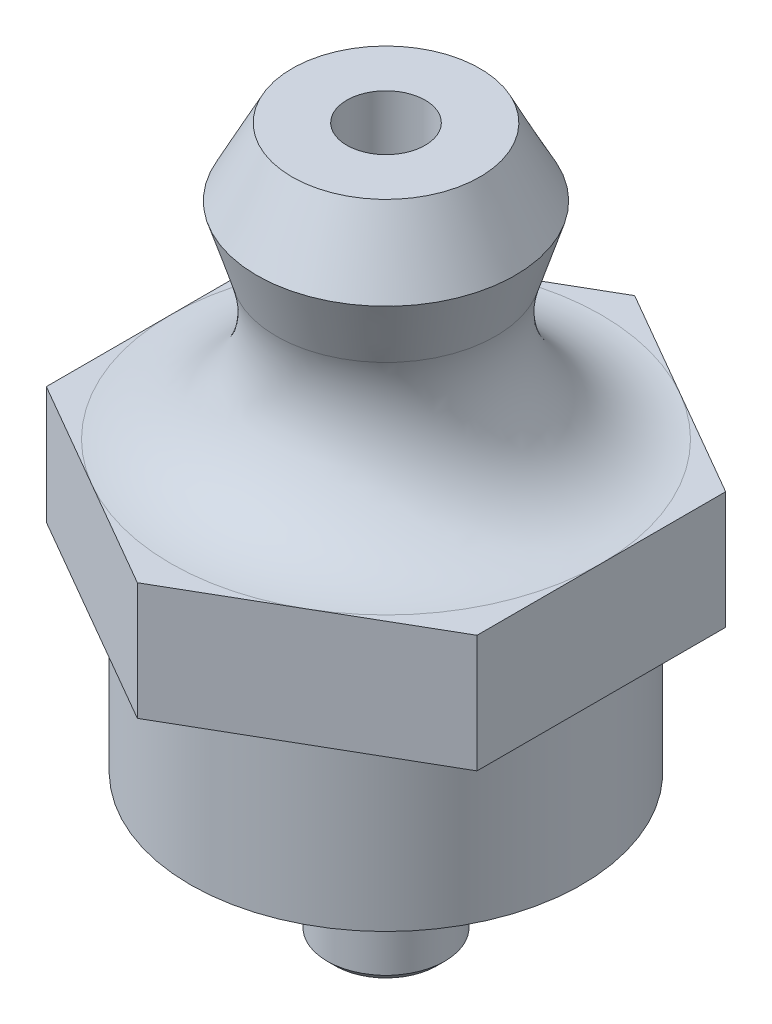
ISO-10303-21;
HEADER;
FILE_DESCRIPTION(('STEP AP214'),'2;1');
FILE_NAME('part.step','',(''),(''),'','','');
FILE_SCHEMA(('AUTOMOTIVE_DESIGN { 1 0 10303 214 1 1 1 1 }'));
ENDSEC;
DATA;
#1=APPLICATION_CONTEXT('core data for automotive mechanical design processes');
#2=APPLICATION_PROTOCOL_DEFINITION('international standard','automotive_design',2000,#1);
#3=PRODUCT_CONTEXT('',#1,'mechanical');
#4=PRODUCT('Part','Part','',(#3));
#5=PRODUCT_RELATED_PRODUCT_CATEGORY('part','',(#4));
#6=PRODUCT_DEFINITION_FORMATION('','',#4);
#7=PRODUCT_DEFINITION_CONTEXT('part definition',#1,'design');
#8=PRODUCT_DEFINITION('design','',#6,#7);
#9=PRODUCT_DEFINITION_SHAPE('','',#8);
#10=(LENGTH_UNIT() NAMED_UNIT(*) SI_UNIT(.MILLI.,.METRE.));
#11=(NAMED_UNIT(*) PLANE_ANGLE_UNIT() SI_UNIT($,.RADIAN.));
#12=(NAMED_UNIT(*) SI_UNIT($,.STERADIAN.) SOLID_ANGLE_UNIT());
#13=UNCERTAINTY_MEASURE_WITH_UNIT(LENGTH_MEASURE(1.E-05),#10,'distance_accuracy_value','');
#14=(GEOMETRIC_REPRESENTATION_CONTEXT(3) GLOBAL_UNCERTAINTY_ASSIGNED_CONTEXT((#13)) GLOBAL_UNIT_ASSIGNED_CONTEXT((#10,
#11,#12)) REPRESENTATION_CONTEXT('',''));
#15=CARTESIAN_POINT('',(0.,0.,0.));
#16=DIRECTION('',(0.,0.,1.));
#17=DIRECTION('',(1.,0.,0.));
#18=AXIS2_PLACEMENT_3D('',#15,#16,#17);
#19=CARTESIAN_POINT('',(0.,0.,0.));
#20=DIRECTION('',(0.,1.,0.));
#21=DIRECTION('',(0.,0.,1.));
#22=AXIS2_PLACEMENT_3D('',#19,#20,#21);
#23=CYLINDRICAL_SURFACE('',#22,1.);
#24=CARTESIAN_POINT('',(0.,0.,0.));
#25=DIRECTION('',(0.,1.,0.));
#26=DIRECTION('',(0.,0.,1.));
#27=AXIS2_PLACEMENT_3D('',#24,#25,#26);
#28=CIRCLE('',#27,1.);
#29=CARTESIAN_POINT('',(0.,0.,1.));
#30=VERTEX_POINT('',#29);
#31=EDGE_CURVE('E181',#30,#30,#28,.T.);
#32=ORIENTED_EDGE('',*,*,#31,.F.);
#33=EDGE_LOOP('',(#32));
#34=FACE_BOUND('',#33,.T.);
#35=CARTESIAN_POINT('',(0.,8.,0.));
#36=DIRECTION('',(0.,1.,0.));
#37=DIRECTION('',(0.,0.,1.));
#38=AXIS2_PLACEMENT_3D('',#35,#36,#37);
#39=CIRCLE('',#38,1.);
#40=CARTESIAN_POINT('',(0.,8.,1.));
#41=VERTEX_POINT('',#40);
#42=EDGE_CURVE('E168',#41,#41,#39,.T.);
#43=ORIENTED_EDGE('',*,*,#42,.T.);
#44=EDGE_LOOP('',(#43));
#45=FACE_BOUND('',#44,.T.);
#46=ADVANCED_FACE('F40',(#34,#45),#23,.F.);
#47=CARTESIAN_POINT('',(-5.,8.,0.));
#48=DIRECTION('',(0.,-1.,0.));
#49=DIRECTION('',(0.,0.,-1.));
#50=AXIS2_PLACEMENT_3D('',#47,#48,#49);
#51=PLANE('',#50);
#52=CARTESIAN_POINT('',(0.,8.,0.));
#53=DIRECTION('',(0.,1.,0.));
#54=DIRECTION('',(0.,0.,1.));
#55=AXIS2_PLACEMENT_3D('',#52,#53,#54);
#56=CIRCLE('',#55,5.);
#57=CARTESIAN_POINT('',(0.,8.,5.));
#58=VERTEX_POINT('',#57);
#59=EDGE_CURVE('E194',#58,#58,#56,.T.);
#60=ORIENTED_EDGE('',*,*,#59,.T.);
#61=EDGE_LOOP('',(#60));
#62=FACE_BOUND('',#61,.T.);
#63=DIRECTION('',(-0.866025403784439,0.,0.5));
#64=VECTOR('',#63,1.);
#65=CARTESIAN_POINT('',(5.5,8.,3.17542648054294));
#66=LINE('',#65,#64);
#67=CARTESIAN_POINT('',(5.5,8.,3.17542648054294));
#68=VERTEX_POINT('',#67);
#69=CARTESIAN_POINT('',(0.,8.,6.35085296108588));
#70=VERTEX_POINT('',#69);
#71=EDGE_CURVE('E124',#68,#70,#66,.T.);
#72=ORIENTED_EDGE('',*,*,#71,.T.);
#73=DIRECTION('',(-0.866025403784438,0.,-0.5));
#74=VECTOR('',#73,1.);
#75=CARTESIAN_POINT('',(0.,8.,6.35085296108588));
#76=LINE('',#75,#74);
#77=CARTESIAN_POINT('',(-5.5,8.,3.17542648054294));
#78=VERTEX_POINT('',#77);
#79=EDGE_CURVE('E155',#70,#78,#76,.T.);
#80=ORIENTED_EDGE('',*,*,#79,.T.);
#81=DIRECTION('',(0.,0.,-1.));
#82=VECTOR('',#81,1.);
#83=CARTESIAN_POINT('',(-5.5,8.,3.17542648054294));
#84=LINE('',#83,#82);
#85=CARTESIAN_POINT('',(-5.5,8.,-3.17542648054294));
#86=VERTEX_POINT('',#85);
#87=EDGE_CURVE('E132',#78,#86,#84,.T.);
#88=ORIENTED_EDGE('',*,*,#87,.T.);
#89=DIRECTION('',(0.866025403784439,0.,-0.5));
#90=VECTOR('',#89,1.);
#91=CARTESIAN_POINT('',(-5.5,8.,-3.17542648054294));
#92=LINE('',#91,#90);
#93=CARTESIAN_POINT('',(0.,8.,-6.35085296108588));
#94=VERTEX_POINT('',#93);
#95=EDGE_CURVE('E158',#86,#94,#92,.T.);
#96=ORIENTED_EDGE('',*,*,#95,.T.);
#97=DIRECTION('',(0.866025403784439,0.,0.5));
#98=VECTOR('',#97,1.);
#99=CARTESIAN_POINT('',(0.,8.,-6.35085296108588));
#100=LINE('',#99,#98);
#101=CARTESIAN_POINT('',(5.5,8.,-3.17542648054294));
#102=VERTEX_POINT('',#101);
#103=EDGE_CURVE('E160',#94,#102,#100,.T.);
#104=ORIENTED_EDGE('',*,*,#103,.T.);
#105=DIRECTION('',(0.,0.,1.));
#106=VECTOR('',#105,1.);
#107=CARTESIAN_POINT('',(5.5,8.,-3.17542648054294));
#108=LINE('',#107,#106);
#109=EDGE_CURVE('E162',#102,#68,#108,.T.);
#110=ORIENTED_EDGE('',*,*,#109,.T.);
#111=EDGE_LOOP('',(#72,#80,#88,#96,#104,#110));
#112=FACE_BOUND('',#111,.T.);
#113=ADVANCED_FACE('F229',(#62,#112),#51,.T.);
#114=CARTESIAN_POINT('',(0.,0.,0.));
#115=DIRECTION('',(0.,1.,0.));
#116=DIRECTION('',(0.,0.,1.));
#117=AXIS2_PLACEMENT_3D('',#114,#115,#116);
#118=CYLINDRICAL_SURFACE('',#117,5.);
#119=CARTESIAN_POINT('',(0.,3.6439693538622,0.));
#120=DIRECTION('',(0.,1.,0.));
#121=DIRECTION('',(0.,0.,1.));
#122=AXIS2_PLACEMENT_3D('',#119,#120,#121);
#123=CIRCLE('',#122,5.);
#124=CARTESIAN_POINT('',(0.,3.6439693538622,5.));
#125=VERTEX_POINT('',#124);
#126=EDGE_CURVE('E191',#125,#125,#123,.T.);
#127=ORIENTED_EDGE('',*,*,#126,.T.);
#128=EDGE_LOOP('',(#127));
#129=FACE_BOUND('',#128,.T.);
#130=ORIENTED_EDGE('',*,*,#59,.F.);
#131=EDGE_LOOP('',(#130));
#132=FACE_BOUND('',#131,.T.);
#133=ADVANCED_FACE('F235',(#129,#132),#118,.T.);
#134=CARTESIAN_POINT('',(0.,3.6439693538622,0.));
#135=DIRECTION('',(0.,1.,0.));
#136=DIRECTION('',(0.,0.,1.));
#137=AXIS2_PLACEMENT_3D('',#134,#135,#136);
#138=CONICAL_SURFACE('',#137,5.,1.09083078249646);
#139=CARTESIAN_POINT('',(0.,1.8219846769311,0.));
#140=DIRECTION('',(0.,1.,0.));
#141=DIRECTION('',(0.,0.,1.));
#142=AXIS2_PLACEMENT_3D('',#139,#140,#141);
#143=CIRCLE('',#142,1.5);
#144=CARTESIAN_POINT('',(0.,1.8219846769311,1.5));
#145=VERTEX_POINT('',#144);
#146=EDGE_CURVE('E188',#145,#145,#143,.T.);
#147=CARTESIAN_POINT('',(0.,1.8219846769311,1.5));
#148=CARTESIAN_POINT('',(0.,1.84096368398247,1.53645833333333));
#149=CARTESIAN_POINT('',(0.,1.85994269103383,1.57291666666667));
#150=CARTESIAN_POINT('',(0.,1.89790070513656,1.64583333333333));
#151=CARTESIAN_POINT('',(0.,1.91687971218793,1.68229166666667));
#152=CARTESIAN_POINT('',(0.,1.95483772629066,1.75520833333333));
#153=CARTESIAN_POINT('',(0.,1.97381673334203,1.79166666666667));
#154=CARTESIAN_POINT('',(0.,2.01177474744476,1.86458333333333));
#155=CARTESIAN_POINT('',(0.,2.03075375449612,1.90104166666667));
#156=CARTESIAN_POINT('',(0.,2.06871176859885,1.97395833333333));
#157=CARTESIAN_POINT('',(0.,2.08769077565022,2.01041666666667));
#158=CARTESIAN_POINT('',(0.,2.12564878975295,2.08333333333333));
#159=CARTESIAN_POINT('',(0.,2.14462779680432,2.11979166666667));
#160=CARTESIAN_POINT('',(0.,2.18258581090705,2.19270833333333));
#161=CARTESIAN_POINT('',(0.,2.20156481795841,2.22916666666667));
#162=CARTESIAN_POINT('',(0.,2.23952283206114,2.30208333333333));
#163=CARTESIAN_POINT('',(0.,2.25850183911251,2.33854166666667));
#164=CARTESIAN_POINT('',(0.,2.29645985321524,2.41145833333333));
#165=CARTESIAN_POINT('',(0.,2.31543886026661,2.44791666666667));
#166=CARTESIAN_POINT('',(0.,2.35339687436934,2.52083333333333));
#167=CARTESIAN_POINT('',(0.,2.3723758814207,2.55729166666667));
#168=CARTESIAN_POINT('',(0.,2.41033389552344,2.63020833333333));
#169=CARTESIAN_POINT('',(0.,2.4293129025748,2.66666666666667));
#170=CARTESIAN_POINT('',(0.,2.46727091667753,2.73958333333333));
#171=CARTESIAN_POINT('',(0.,2.4862499237289,2.77604166666667));
#172=CARTESIAN_POINT('',(0.,2.52420793783163,2.84895833333333));
#173=CARTESIAN_POINT('',(0.,2.54318694488299,2.88541666666667));
#174=CARTESIAN_POINT('',(0.,2.58114495898573,2.95833333333333));
#175=CARTESIAN_POINT('',(0.,2.60012396603709,2.99479166666667));
#176=CARTESIAN_POINT('',(0.,2.63808198013982,3.06770833333333));
#177=CARTESIAN_POINT('',(0.,2.65706098719119,3.10416666666667));
#178=CARTESIAN_POINT('',(0.,2.69501900129392,3.17708333333333));
#179=CARTESIAN_POINT('',(0.,2.71399800834529,3.21354166666667));
#180=CARTESIAN_POINT('',(0.,2.75195602244802,3.28645833333333));
#181=CARTESIAN_POINT('',(0.,2.77093502949938,3.32291666666667));
#182=CARTESIAN_POINT('',(0.,2.80889304360211,3.39583333333333));
#183=CARTESIAN_POINT('',(0.,2.82787205065348,3.43229166666667));
#184=CARTESIAN_POINT('',(0.,2.86583006475621,3.50520833333333));
#185=CARTESIAN_POINT('',(0.,2.88480907180758,3.54166666666667));
#186=CARTESIAN_POINT('',(0.,2.92276708591031,3.61458333333333));
#187=CARTESIAN_POINT('',(0.,2.94174609296167,3.65104166666667));
#188=CARTESIAN_POINT('',(0.,2.9797041070644,3.72395833333333));
#189=CARTESIAN_POINT('',(0.,2.99868311411577,3.76041666666667));
#190=CARTESIAN_POINT('',(0.,3.0366411282185,3.83333333333333));
#191=CARTESIAN_POINT('',(0.,3.05562013526987,3.86979166666667));
#192=CARTESIAN_POINT('',(0.,3.0935781493726,3.94270833333333));
#193=CARTESIAN_POINT('',(0.,3.11255715642396,3.97916666666667));
#194=CARTESIAN_POINT('',(0.,3.15051517052669,4.05208333333333));
#195=CARTESIAN_POINT('',(0.,3.16949417757806,4.08854166666667));
#196=CARTESIAN_POINT('',(0.,3.20745219168079,4.16145833333333));
#197=CARTESIAN_POINT('',(0.,3.22643119873216,4.19791666666667));
#198=CARTESIAN_POINT('',(0.,3.26438921283489,4.27083333333333));
#199=CARTESIAN_POINT('',(0.,3.28336821988625,4.30729166666667));
#200=CARTESIAN_POINT('',(0.,3.32132623398899,4.38020833333333));
#201=CARTESIAN_POINT('',(0.,3.34030524104035,4.41666666666667));
#202=CARTESIAN_POINT('',(0.,3.37826325514308,4.48958333333333));
#203=CARTESIAN_POINT('',(0.,3.39724226219445,4.52604166666667));
#204=CARTESIAN_POINT('',(0.,3.43520027629718,4.59895833333333));
#205=CARTESIAN_POINT('',(0.,3.45417928334854,4.63541666666667));
#206=CARTESIAN_POINT('',(0.,3.49213729745128,4.70833333333333));
#207=CARTESIAN_POINT('',(0.,3.51111630450264,4.74479166666667));
#208=CARTESIAN_POINT('',(0.,3.54907431860537,4.81770833333333));
#209=CARTESIAN_POINT('',(0.,3.56805332565674,4.85416666666667));
#210=CARTESIAN_POINT('',(0.,3.60601133975947,4.92708333333333));
#211=CARTESIAN_POINT('',(0.,3.62499034681084,4.96354166666667));
#212=CARTESIAN_POINT('',(0.,3.6439693538622,5.));
#213=B_SPLINE_CURVE_WITH_KNOTS('',3,(#147,#148,#149,#150,#151,#152,#153,#154,#155,#156,#157,
#158,#159,#160,#161,#162,#163,#164,#165,#166,#167,#168,#169,#170,#171,#172,#173,#174,#175,#176,
#177,#178,#179,#180,#181,#182,#183,#184,#185,#186,#187,#188,#189,#190,#191,#192,#193,#194,#195,
#196,#197,#198,#199,#200,#201,#202,#203,#204,#205,#206,#207,#208,#209,#210,#211,#212),
.UNSPECIFIED.,.F.,.F.,(4,2,2,2,2,2,2,2,2,2,2,2,2,2,2,2,2,2,2,2,2,2,2,2,2,2,2,2,2,2,2,2,4),(0.,
0.123307400438506,0.246614800877012,0.369922201315518,0.493229601754024,0.61653700219253,
0.739844402631036,0.863151803069542,0.986459203508048,1.10976660394655,1.23307400438506,
1.35638140482357,1.47968880526207,1.60299620570058,1.72630360613908,1.84961100657759,
1.9729184070161,2.0962258074546,2.21953320789311,2.34284060833162,2.46614800877012,
2.58945540920863,2.71276280964713,2.83607021008564,2.95937761052414,3.08268501096265,
3.20599241140116,3.32929981183966,3.45260721227817,3.57591461271668,3.69922201315518,
3.82252941359369,3.94583681403219),.UNSPECIFIED.);
#214=EDGE_CURVE('BSEAM271',#145,#125,#213,.T.);
#215=ORIENTED_EDGE('',*,*,#146,.T.);
#216=ORIENTED_EDGE('',*,*,#126,.F.);
#217=ORIENTED_EDGE('',*,*,#214,.T.);
#218=ORIENTED_EDGE('',*,*,#214,.F.);
#219=EDGE_LOOP('',(#215,#217,#216,#218));
#220=FACE_BOUND('',#219,.T.);
#221=ADVANCED_FACE('F271',(#220),#138,.T.);
#222=CARTESIAN_POINT('',(0.,0.,0.));
#223=DIRECTION('',(0.,1.,0.));
#224=DIRECTION('',(0.,0.,1.));
#225=AXIS2_PLACEMENT_3D('',#222,#223,#224);
#226=CYLINDRICAL_SURFACE('',#225,1.5);
#227=CARTESIAN_POINT('',(0.,0.200000000000006,0.));
#228=DIRECTION('',(0.,-1.,0.));
#229=DIRECTION('',(0.,0.,-1.));
#230=AXIS2_PLACEMENT_3D('',#227,#228,#229);
#231=CIRCLE('',#230,1.5);
#232=CARTESIAN_POINT('',(0.,0.200000000000006,-1.5));
#233=VERTEX_POINT('',#232);
#234=EDGE_CURVE('E48',#233,#233,#231,.F.);
#235=ORIENTED_EDGE('',*,*,#234,.T.);
#236=EDGE_LOOP('',(#235));
#237=FACE_BOUND('',#236,.T.);
#238=ORIENTED_EDGE('',*,*,#146,.F.);
#239=EDGE_LOOP('',(#238));
#240=FACE_BOUND('',#239,.T.);
#241=ADVANCED_FACE('F214',(#237,#240),#226,.T.);
#242=CARTESIAN_POINT('',(-1.,0.,0.));
#243=DIRECTION('',(0.,-1.,0.));
#244=DIRECTION('',(0.,0.,-1.));
#245=AXIS2_PLACEMENT_3D('',#242,#243,#244);
#246=PLANE('',#245);
#247=CARTESIAN_POINT('',(0.,0.,0.));
#248=DIRECTION('',(0.,-1.,0.));
#249=DIRECTION('',(0.,0.,-1.));
#250=AXIS2_PLACEMENT_3D('',#247,#248,#249);
#251=CIRCLE('',#250,1.3);
#252=CARTESIAN_POINT('',(0.,0.,-1.3));
#253=VERTEX_POINT('',#252);
#254=EDGE_CURVE('E11',#253,#253,#251,.T.);
#255=ORIENTED_EDGE('',*,*,#254,.T.);
#256=EDGE_LOOP('',(#255));
#257=FACE_BOUND('',#256,.T.);
#258=ORIENTED_EDGE('',*,*,#31,.T.);
#259=EDGE_LOOP('',(#258));
#260=FACE_BOUND('',#259,.T.);
#261=ADVANCED_FACE('F278',(#257,#260),#246,.T.);
#262=CARTESIAN_POINT('',(0.,11.,6.35085296108588));
#263=DIRECTION('',(0.,1.,0.));
#264=DIRECTION('',(0.,0.,1.));
#265=AXIS2_PLACEMENT_3D('',#262,#263,#264);
#266=PLANE('',#265);
#267=DIRECTION('',(-0.866025403784439,0.,0.5));
#268=VECTOR('',#267,1.);
#269=CARTESIAN_POINT('',(5.5,11.,3.17542648054294));
#270=LINE('',#269,#268);
#271=CARTESIAN_POINT('',(2.75,11.,4.76313972081441));
#272=VERTEX_POINT('',#271);
#273=CARTESIAN_POINT('',(0.,11.,6.35085296108588));
#274=VERTEX_POINT('',#273);
#275=EDGE_CURVE('E153',#272,#274,#270,.T.);
#276=ORIENTED_EDGE('',*,*,#275,.F.);
#277=CARTESIAN_POINT('',(0.,11.,0.));
#278=DIRECTION('',(0.,1.,0.));
#279=DIRECTION('',(0.,0.,1.));
#280=AXIS2_PLACEMENT_3D('',#277,#278,#279);
#281=CIRCLE('',#280,5.5);
#282=CARTESIAN_POINT('',(-2.75,11.,4.76313972081441));
#283=VERTEX_POINT('',#282);
#284=EDGE_CURVE('E62',#283,#272,#281,.T.);
#285=ORIENTED_EDGE('',*,*,#284,.F.);
#286=DIRECTION('',(-0.866025403784438,0.,-0.5));
#287=VECTOR('',#286,1.);
#288=CARTESIAN_POINT('',(0.,11.,6.35085296108588));
#289=LINE('',#288,#287);
#290=EDGE_CURVE('E120',#274,#283,#289,.T.);
#291=ORIENTED_EDGE('',*,*,#290,.F.);
#292=EDGE_LOOP('',(#276,#285,#291));
#293=FACE_BOUND('',#292,.T.);
#294=ADVANCED_FACE('F226',(#293),#266,.T.);
#295=CARTESIAN_POINT('',(-5.5,11.,3.17542648054294));
#296=DIRECTION('',(-1.,0.,0.));
#297=DIRECTION('',(0.,0.,1.));
#298=AXIS2_PLACEMENT_3D('',#295,#296,#297);
#299=PLANE('',#298);
#300=DIRECTION('',(0.,-1.,0.));
#301=VECTOR('',#300,1.);
#302=CARTESIAN_POINT('',(-5.5,11.,-3.17542648054294));
#303=LINE('',#302,#301);
#304=CARTESIAN_POINT('',(-5.5,11.,-3.17542648054294));
#305=VERTEX_POINT('',#304);
#306=EDGE_CURVE('E133',#305,#86,#303,.T.);
#307=ORIENTED_EDGE('',*,*,#306,.T.);
#308=ORIENTED_EDGE('',*,*,#87,.F.);
#309=DIRECTION('',(0.,-1.,0.));
#310=VECTOR('',#309,1.);
#311=CARTESIAN_POINT('',(-5.5,11.,3.17542648054294));
#312=LINE('',#311,#310);
#313=CARTESIAN_POINT('',(-5.5,11.,3.17542648054294));
#314=VERTEX_POINT('',#313);
#315=EDGE_CURVE('E117',#314,#78,#312,.T.);
#316=ORIENTED_EDGE('',*,*,#315,.F.);
#317=DIRECTION('',(0.,0.,-1.));
#318=VECTOR('',#317,1.);
#319=CARTESIAN_POINT('',(-5.5,11.,3.17542648054294));
#320=LINE('',#319,#318);
#321=CARTESIAN_POINT('',(-5.5,11.,0.));
#322=VERTEX_POINT('',#321);
#323=EDGE_CURVE('E130',#314,#322,#320,.T.);
#324=ORIENTED_EDGE('',*,*,#323,.T.);
#325=EDGE_CURVE('E139',#322,#305,#320,.T.);
#326=ORIENTED_EDGE('',*,*,#325,.T.);
#327=EDGE_LOOP('',(#307,#308,#316,#324,#326));
#328=FACE_BOUND('',#327,.T.);
#329=ADVANCED_FACE('F129',(#328),#299,.T.);
#330=CARTESIAN_POINT('',(-5.5,11.,-3.17542648054294));
#331=DIRECTION('',(-0.5,0.,-0.866025403784439));
#332=DIRECTION('',(-0.866025403784439,0.,0.5));
#333=AXIS2_PLACEMENT_3D('',#330,#331,#332);
#334=PLANE('',#333);
#335=DIRECTION('',(0.,-1.,0.));
#336=VECTOR('',#335,1.);
#337=CARTESIAN_POINT('',(0.,11.,-6.35085296108588));
#338=LINE('',#337,#336);
#339=CARTESIAN_POINT('',(0.,11.,-6.35085296108588));
#340=VERTEX_POINT('',#339);
#341=EDGE_CURVE('E175',#340,#94,#338,.T.);
#342=ORIENTED_EDGE('',*,*,#341,.T.);
#343=ORIENTED_EDGE('',*,*,#95,.F.);
#344=ORIENTED_EDGE('',*,*,#306,.F.);
#345=DIRECTION('',(0.866025403784439,0.,-0.5));
#346=VECTOR('',#345,1.);
#347=CARTESIAN_POINT('',(-5.5,11.,-3.17542648054294));
#348=LINE('',#347,#346);
#349=CARTESIAN_POINT('',(-2.75,11.,-4.76313972081441));
#350=VERTEX_POINT('',#349);
#351=EDGE_CURVE('E141',#305,#350,#348,.T.);
#352=ORIENTED_EDGE('',*,*,#351,.T.);
#353=EDGE_CURVE('E138',#350,#340,#348,.T.);
#354=ORIENTED_EDGE('',*,*,#353,.T.);
#355=EDGE_LOOP('',(#342,#343,#344,#352,#354));
#356=FACE_BOUND('',#355,.T.);
#357=ADVANCED_FACE('F288',(#356),#334,.T.);
#358=CARTESIAN_POINT('',(0.,11.,-6.35085296108588));
#359=DIRECTION('',(0.5,0.,-0.866025403784439));
#360=DIRECTION('',(-0.866025403784439,0.,-0.5));
#361=AXIS2_PLACEMENT_3D('',#358,#359,#360);
#362=PLANE('',#361);
#363=DIRECTION('',(0.,-1.,0.));
#364=VECTOR('',#363,1.);
#365=CARTESIAN_POINT('',(5.5,11.,-3.17542648054294));
#366=LINE('',#365,#364);
#367=CARTESIAN_POINT('',(5.5,11.,-3.17542648054294));
#368=VERTEX_POINT('',#367);
#369=EDGE_CURVE('E172',#368,#102,#366,.T.);
#370=ORIENTED_EDGE('',*,*,#369,.T.);
#371=ORIENTED_EDGE('',*,*,#103,.F.);
#372=ORIENTED_EDGE('',*,*,#341,.F.);
#373=DIRECTION('',(0.866025403784439,0.,0.5));
#374=VECTOR('',#373,1.);
#375=CARTESIAN_POINT('',(0.,11.,-6.35085296108588));
#376=LINE('',#375,#374);
#377=CARTESIAN_POINT('',(2.75,11.,-4.76313972081441));
#378=VERTEX_POINT('',#377);
#379=EDGE_CURVE('E146',#340,#378,#376,.T.);
#380=ORIENTED_EDGE('',*,*,#379,.T.);
#381=EDGE_CURVE('E145',#378,#368,#376,.T.);
#382=ORIENTED_EDGE('',*,*,#381,.T.);
#383=EDGE_LOOP('',(#370,#371,#372,#380,#382));
#384=FACE_BOUND('',#383,.T.);
#385=ADVANCED_FACE('F291',(#384),#362,.T.);
#386=CARTESIAN_POINT('',(5.5,11.,-3.17542648054294));
#387=DIRECTION('',(1.,0.,0.));
#388=DIRECTION('',(0.,0.,-1.));
#389=AXIS2_PLACEMENT_3D('',#386,#387,#388);
#390=PLANE('',#389);
#391=DIRECTION('',(0.,-1.,0.));
#392=VECTOR('',#391,1.);
#393=CARTESIAN_POINT('',(5.5,11.,3.17542648054294));
#394=LINE('',#393,#392);
#395=CARTESIAN_POINT('',(5.5,11.,3.17542648054294));
#396=VERTEX_POINT('',#395);
#397=EDGE_CURVE('E169',#396,#68,#394,.T.);
#398=ORIENTED_EDGE('',*,*,#397,.T.);
#399=ORIENTED_EDGE('',*,*,#109,.F.);
#400=ORIENTED_EDGE('',*,*,#369,.F.);
#401=DIRECTION('',(0.,0.,1.));
#402=VECTOR('',#401,1.);
#403=CARTESIAN_POINT('',(5.5,11.,-3.17542648054294));
#404=LINE('',#403,#402);
#405=CARTESIAN_POINT('',(5.5,11.,0.));
#406=VERTEX_POINT('',#405);
#407=EDGE_CURVE('E150',#368,#406,#404,.T.);
#408=ORIENTED_EDGE('',*,*,#407,.T.);
#409=EDGE_CURVE('E149',#406,#396,#404,.T.);
#410=ORIENTED_EDGE('',*,*,#409,.T.);
#411=EDGE_LOOP('',(#398,#399,#400,#408,#410));
#412=FACE_BOUND('',#411,.T.);
#413=ADVANCED_FACE('F295',(#412),#390,.T.);
#414=CARTESIAN_POINT('',(5.5,11.,3.17542648054294));
#415=DIRECTION('',(0.5,0.,0.866025403784439));
#416=DIRECTION('',(0.866025403784439,0.,-0.5));
#417=AXIS2_PLACEMENT_3D('',#414,#415,#416);
#418=PLANE('',#417);
#419=DIRECTION('',(0.,-1.,0.));
#420=VECTOR('',#419,1.);
#421=CARTESIAN_POINT('',(0.,11.,6.35085296108588));
#422=LINE('',#421,#420);
#423=EDGE_CURVE('E165',#274,#70,#422,.T.);
#424=ORIENTED_EDGE('',*,*,#423,.T.);
#425=ORIENTED_EDGE('',*,*,#71,.F.);
#426=ORIENTED_EDGE('',*,*,#397,.F.);
#427=EDGE_CURVE('E55',#396,#272,#270,.T.);
#428=ORIENTED_EDGE('',*,*,#427,.T.);
#429=ORIENTED_EDGE('',*,*,#275,.T.);
#430=EDGE_LOOP('',(#424,#425,#426,#428,#429));
#431=FACE_BOUND('',#430,.T.);
#432=ADVANCED_FACE('F285',(#431),#418,.T.);
#433=CARTESIAN_POINT('',(0.,11.,6.35085296108588));
#434=DIRECTION('',(-0.5,0.,0.866025403784438));
#435=DIRECTION('',(0.866025403784439,0.,0.5));
#436=AXIS2_PLACEMENT_3D('',#433,#434,#435);
#437=PLANE('',#436);
#438=ORIENTED_EDGE('',*,*,#79,.F.);
#439=ORIENTED_EDGE('',*,*,#423,.F.);
#440=ORIENTED_EDGE('',*,*,#290,.T.);
#441=EDGE_CURVE('E113',#283,#314,#289,.T.);
#442=ORIENTED_EDGE('',*,*,#441,.T.);
#443=ORIENTED_EDGE('',*,*,#315,.T.);
#444=EDGE_LOOP('',(#438,#439,#440,#442,#443));
#445=FACE_BOUND('',#444,.T.);
#446=ADVANCED_FACE('F116',(#445),#437,.T.);
#447=ORIENTED_EDGE('',*,*,#409,.F.);
#448=EDGE_CURVE('E197',#272,#406,#281,.T.);
#449=ORIENTED_EDGE('',*,*,#448,.F.);
#450=ORIENTED_EDGE('',*,*,#427,.F.);
#451=EDGE_LOOP('',(#447,#449,#450));
#452=FACE_BOUND('',#451,.T.);
#453=ADVANCED_FACE('F284',(#452),#266,.T.);
#454=ORIENTED_EDGE('',*,*,#381,.F.);
#455=EDGE_CURVE('E201',#406,#378,#281,.T.);
#456=ORIENTED_EDGE('',*,*,#455,.F.);
#457=ORIENTED_EDGE('',*,*,#407,.F.);
#458=EDGE_LOOP('',(#454,#456,#457));
#459=FACE_BOUND('',#458,.T.);
#460=ADVANCED_FACE('F308',(#459),#266,.T.);
#461=ORIENTED_EDGE('',*,*,#353,.F.);
#462=EDGE_CURVE('E325',#378,#350,#281,.T.);
#463=ORIENTED_EDGE('',*,*,#462,.F.);
#464=ORIENTED_EDGE('',*,*,#379,.F.);
#465=EDGE_LOOP('',(#461,#463,#464));
#466=FACE_BOUND('',#465,.T.);
#467=ADVANCED_FACE('F313',(#466),#266,.T.);
#468=ORIENTED_EDGE('',*,*,#325,.F.);
#469=EDGE_CURVE('E324',#350,#322,#281,.T.);
#470=ORIENTED_EDGE('',*,*,#469,.F.);
#471=ORIENTED_EDGE('',*,*,#351,.F.);
#472=EDGE_LOOP('',(#468,#470,#471));
#473=FACE_BOUND('',#472,.T.);
#474=ADVANCED_FACE('F260',(#473),#266,.T.);
#475=ORIENTED_EDGE('',*,*,#441,.F.);
#476=EDGE_CURVE('E136',#322,#283,#281,.T.);
#477=ORIENTED_EDGE('',*,*,#476,.F.);
#478=ORIENTED_EDGE('',*,*,#323,.F.);
#479=EDGE_LOOP('',(#475,#477,#478));
#480=FACE_BOUND('',#479,.T.);
#481=ADVANCED_FACE('F135',(#480),#266,.T.);
#482=CARTESIAN_POINT('',(-1.,18.,0.));
#483=DIRECTION('',(0.,1.,0.));
#484=DIRECTION('',(0.,0.,1.));
#485=AXIS2_PLACEMENT_3D('',#482,#483,#484);
#486=PLANE('',#485);
#487=CARTESIAN_POINT('',(0.,18.,0.));
#488=DIRECTION('',(0.,1.,0.));
#489=DIRECTION('',(0.,0.,1.));
#490=AXIS2_PLACEMENT_3D('',#487,#488,#489);
#491=CIRCLE('',#490,2.4);
#492=CARTESIAN_POINT('',(0.,18.,2.4));
#493=VERTEX_POINT('',#492);
#494=EDGE_CURVE('E207',#493,#493,#491,.T.);
#495=ORIENTED_EDGE('',*,*,#494,.T.);
#496=EDGE_LOOP('',(#495));
#497=FACE_BOUND('',#496,.T.);
#498=CARTESIAN_POINT('',(0.,18.,0.));
#499=DIRECTION('',(0.,1.,0.));
#500=DIRECTION('',(0.,0.,1.));
#501=AXIS2_PLACEMENT_3D('',#498,#499,#500);
#502=CIRCLE('',#501,1.);
#503=CARTESIAN_POINT('',(0.,18.,1.));
#504=VERTEX_POINT('',#503);
#505=EDGE_CURVE('E185',#504,#504,#502,.T.);
#506=ORIENTED_EDGE('',*,*,#505,.F.);
#507=EDGE_LOOP('',(#506));
#508=FACE_BOUND('',#507,.T.);
#509=ADVANCED_FACE('F243',(#497,#508),#486,.T.);
#510=CARTESIAN_POINT('',(0.,11.,0.));
#511=DIRECTION('',(0.,1.,0.));
#512=DIRECTION('',(0.,0.,1.));
#513=AXIS2_PLACEMENT_3D('',#510,#511,#512);
#514=CIRCLE('',#513,1.);
#515=CARTESIAN_POINT('',(0.,11.,1.));
#516=VERTEX_POINT('',#515);
#517=EDGE_CURVE('E182',#516,#516,#514,.T.);
#518=ORIENTED_EDGE('',*,*,#517,.F.);
#519=EDGE_LOOP('',(#518));
#520=FACE_BOUND('',#519,.T.);
#521=ORIENTED_EDGE('',*,*,#505,.T.);
#522=EDGE_LOOP('',(#521));
#523=FACE_BOUND('',#522,.T.);
#524=ADVANCED_FACE('F231',(#520,#523),#23,.F.);
#525=CARTESIAN_POINT('',(0.,18.,0.));
#526=DIRECTION('',(0.,-1.,0.));
#527=DIRECTION('',(0.,0.,-1.));
#528=AXIS2_PLACEMENT_3D('',#525,#526,#527);
#529=CONICAL_SURFACE('',#528,2.4,0.479965544298442);
#530=CARTESIAN_POINT('',(0.,16.271116085726,0.));
#531=DIRECTION('',(0.,1.,0.));
#532=DIRECTION('',(0.,0.,1.));
#533=AXIS2_PLACEMENT_3D('',#530,#531,#532);
#534=CIRCLE('',#533,3.3);
#535=CARTESIAN_POINT('',(0.,16.271116085726,3.3));
#536=VERTEX_POINT('',#535);
#537=EDGE_CURVE('E204',#536,#536,#534,.T.);
#538=ORIENTED_EDGE('',*,*,#537,.T.);
#539=EDGE_LOOP('',(#538));
#540=FACE_BOUND('',#539,.T.);
#541=ORIENTED_EDGE('',*,*,#494,.F.);
#542=EDGE_LOOP('',(#541));
#543=FACE_BOUND('',#542,.T.);
#544=ADVANCED_FACE('F242',(#540,#543),#529,.T.);
#545=CARTESIAN_POINT('',(0.,16.271116085726,0.));
#546=DIRECTION('',(0.,1.,0.));
#547=DIRECTION('',(0.,0.,1.));
#548=AXIS2_PLACEMENT_3D('',#545,#546,#547);
#549=CONICAL_SURFACE('',#548,3.3,0.303681801215647);
#550=CARTESIAN_POINT('',(0.,14.6755834566137,0.));
#551=DIRECTION('',(0.,1.,0.));
#552=DIRECTION('',(0.,0.,1.));
#553=AXIS2_PLACEMENT_3D('',#550,#551,#552);
#554=CIRCLE('',#553,2.8);
#555=CARTESIAN_POINT('',(0.,14.6755834566137,2.8));
#556=VERTEX_POINT('',#555);
#557=EDGE_CURVE('E200',#556,#556,#554,.T.);
#558=ORIENTED_EDGE('',*,*,#557,.T.);
#559=EDGE_LOOP('',(#558));
#560=FACE_BOUND('',#559,.T.);
#561=ORIENTED_EDGE('',*,*,#537,.F.);
#562=EDGE_LOOP('',(#561));
#563=FACE_BOUND('',#562,.T.);
#564=ADVANCED_FACE('F249',(#560,#563),#549,.T.);
#565=CARTESIAN_POINT('',(0.,13.8294710203227,0.));
#566=DIRECTION('',(0.,1.,0.));
#567=DIRECTION('',(0.,0.,1.));
#568=AXIS2_PLACEMENT_3D('',#565,#566,#567);
#569=TOROIDAL_SURFACE('',#568,5.5,2.82947102032273);
#570=ORIENTED_EDGE('',*,*,#448,.T.);
#571=ORIENTED_EDGE('',*,*,#455,.T.);
#572=ORIENTED_EDGE('',*,*,#462,.T.);
#573=ORIENTED_EDGE('',*,*,#469,.T.);
#574=ORIENTED_EDGE('',*,*,#476,.T.);
#575=ORIENTED_EDGE('',*,*,#284,.T.);
#576=EDGE_LOOP('',(#570,#571,#572,#573,#574,#575));
#577=FACE_BOUND('',#576,.T.);
#578=ORIENTED_EDGE('',*,*,#557,.F.);
#579=EDGE_LOOP('',(#578));
#580=FACE_BOUND('',#579,.T.);
#581=ADVANCED_FACE('F264',(#577,#580),#569,.F.);
#582=CARTESIAN_POINT('',(0.,8.,6.35085296108588));
#583=DIRECTION('',(0.,1.,0.));
#584=DIRECTION('',(0.,0.,1.));
#585=AXIS2_PLACEMENT_3D('',#582,#583,#584);
#586=PLANE('',#585);
#587=ORIENTED_EDGE('',*,*,#42,.F.);
#588=EDGE_LOOP('',(#587));
#589=FACE_BOUND('',#588,.T.);
#590=ADVANCED_FACE('F223',(#589),#586,.F.);
#591=ORIENTED_EDGE('',*,*,#517,.T.);
#592=EDGE_LOOP('',(#591));
#593=FACE_BOUND('',#592,.T.);
#594=ADVANCED_FACE('F218',(#593),#266,.T.);
#595=CARTESIAN_POINT('',(0.,0.200000000000006,0.));
#596=DIRECTION('',(0.,1.,0.));
#597=DIRECTION('',(0.,0.,1.));
#598=AXIS2_PLACEMENT_3D('',#595,#596,#597);
#599=CONICAL_SURFACE('',#598,1.5,0.785398163397443);
#600=ORIENTED_EDGE('',*,*,#254,.F.);
#601=EDGE_LOOP('',(#600));
#602=FACE_BOUND('',#601,.T.);
#603=ORIENTED_EDGE('',*,*,#234,.F.);
#604=EDGE_LOOP('',(#603));
#605=FACE_BOUND('',#604,.T.);
#606=ADVANCED_FACE('F42',(#602,#605),#599,.T.);
#607=CLOSED_SHELL('',(#46,#113,#133,#221,#241,#261,#294,#329,#357,#385,#413,#432,#446,#453,#460,
#467,#474,#481,#509,#524,#544,#564,#581,#590,#594,#606));
#608=MANIFOLD_SOLID_BREP('B2',#607);
#609=ADVANCED_BREP_SHAPE_REPRESENTATION('',(#18,#608),#14);
#610=SHAPE_DEFINITION_REPRESENTATION(#9,#609);
ENDSEC;
END-ISO-10303-21;
